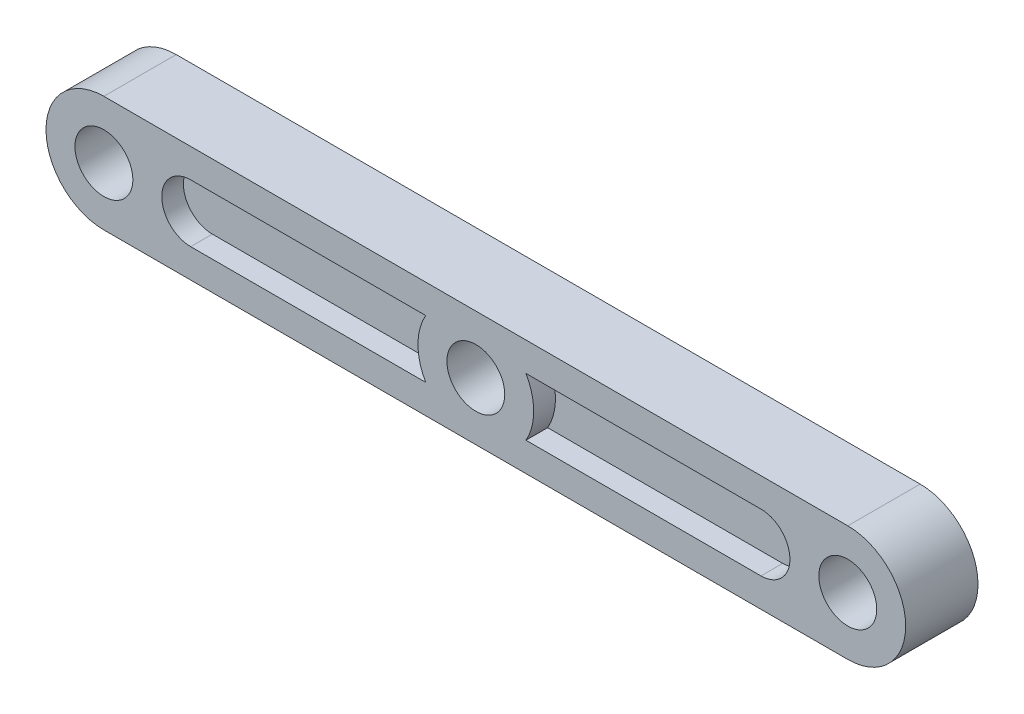
ISO-10303-21;
HEADER;
FILE_DESCRIPTION(('STEP AP214'),'2;1');
FILE_NAME('part.step','',(''),(''),'','','');
FILE_SCHEMA(('AUTOMOTIVE_DESIGN { 1 0 10303 214 1 1 1 1 }'));
ENDSEC;
DATA;
#1=APPLICATION_CONTEXT('core data for automotive mechanical design processes');
#2=APPLICATION_PROTOCOL_DEFINITION('international standard','automotive_design',2000,#1);
#3=PRODUCT_CONTEXT('',#1,'mechanical');
#4=PRODUCT('Part','Part','',(#3));
#5=PRODUCT_RELATED_PRODUCT_CATEGORY('part','',(#4));
#6=PRODUCT_DEFINITION_FORMATION('','',#4);
#7=PRODUCT_DEFINITION_CONTEXT('part definition',#1,'design');
#8=PRODUCT_DEFINITION('design','',#6,#7);
#9=PRODUCT_DEFINITION_SHAPE('','',#8);
#10=(LENGTH_UNIT() NAMED_UNIT(*) SI_UNIT(.MILLI.,.METRE.));
#11=(NAMED_UNIT(*) PLANE_ANGLE_UNIT() SI_UNIT($,.RADIAN.));
#12=(NAMED_UNIT(*) SI_UNIT($,.STERADIAN.) SOLID_ANGLE_UNIT());
#13=UNCERTAINTY_MEASURE_WITH_UNIT(LENGTH_MEASURE(1.E-05),#10,'distance_accuracy_value','');
#14=(GEOMETRIC_REPRESENTATION_CONTEXT(3) GLOBAL_UNCERTAINTY_ASSIGNED_CONTEXT((#13)) GLOBAL_UNIT_ASSIGNED_CONTEXT((#10,
#11,#12)) REPRESENTATION_CONTEXT('',''));
#15=CARTESIAN_POINT('',(0.,0.,0.));
#16=DIRECTION('',(0.,0.,1.));
#17=DIRECTION('',(1.,0.,0.));
#18=AXIS2_PLACEMENT_3D('',#15,#16,#17);
#19=CARTESIAN_POINT('',(45.4197,-2.5,1.5));
#20=DIRECTION('',(0.,-1.,0.));
#21=DIRECTION('',(1.,0.,0.));
#22=AXIS2_PLACEMENT_3D('',#19,#20,#21);
#23=PLANE('',#22);
#24=DIRECTION('',(-1.,0.,0.));
#25=VECTOR('',#24,1.);
#26=CARTESIAN_POINT('',(45.4197,-2.5,0.));
#27=LINE('',#26,#25);
#28=CARTESIAN_POINT('',(45.4197,-2.5,0.));
#29=VERTEX_POINT('',#28);
#30=CARTESIAN_POINT('',(28.8323489991992,-2.5,0.));
#31=VERTEX_POINT('',#30);
#32=EDGE_CURVE('E56',#29,#31,#27,.T.);
#33=ORIENTED_EDGE('',*,*,#32,.T.);
#34=DIRECTION('',(0.,0.,1.));
#35=VECTOR('',#34,1.);
#36=CARTESIAN_POINT('',(28.8323489991992,-2.5,0.));
#37=LINE('',#36,#35);
#38=CARTESIAN_POINT('',(28.8323489991992,-2.5,1.5));
#39=VERTEX_POINT('',#38);
#40=EDGE_CURVE('E309',#31,#39,#37,.T.);
#41=ORIENTED_EDGE('',*,*,#40,.T.);
#42=DIRECTION('',(-1.,0.,0.));
#43=VECTOR('',#42,1.);
#44=CARTESIAN_POINT('',(45.4197,-2.5,1.5));
#45=LINE('',#44,#43);
#46=CARTESIAN_POINT('',(45.4197,-2.5,1.5));
#47=VERTEX_POINT('',#46);
#48=EDGE_CURVE('E240',#47,#39,#45,.T.);
#49=ORIENTED_EDGE('',*,*,#48,.F.);
#50=DIRECTION('',(0.,0.,-1.));
#51=VECTOR('',#50,1.);
#52=CARTESIAN_POINT('',(45.4197,-2.5,1.5));
#53=LINE('',#52,#51);
#54=EDGE_CURVE('E243',#47,#29,#53,.T.);
#55=ORIENTED_EDGE('',*,*,#54,.T.);
#56=EDGE_LOOP('',(#33,#41,#49,#55));
#57=FACE_BOUND('',#56,.T.);
#58=ADVANCED_FACE('F33',(#57),#23,.F.);
#59=CARTESIAN_POINT('',(6.,2.5,1.5));
#60=DIRECTION('',(0.,1.,0.));
#61=DIRECTION('',(-1.,0.,0.));
#62=AXIS2_PLACEMENT_3D('',#59,#60,#61);
#63=PLANE('',#62);
#64=DIRECTION('',(1.,0.,0.));
#65=VECTOR('',#64,1.);
#66=CARTESIAN_POINT('',(6.,2.5,0.));
#67=LINE('',#66,#65);
#68=CARTESIAN_POINT('',(6.,2.5,0.));
#69=VERTEX_POINT('',#68);
#70=CARTESIAN_POINT('',(22.5873510008008,2.5,0.));
#71=VERTEX_POINT('',#70);
#72=EDGE_CURVE('E253',#69,#71,#67,.T.);
#73=ORIENTED_EDGE('',*,*,#72,.T.);
#74=DIRECTION('',(0.,0.,1.));
#75=VECTOR('',#74,1.);
#76=CARTESIAN_POINT('',(22.5873510008008,2.5,0.));
#77=LINE('',#76,#75);
#78=CARTESIAN_POINT('',(22.5873510008008,2.5,1.5));
#79=VERTEX_POINT('',#78);
#80=EDGE_CURVE('E315',#71,#79,#77,.T.);
#81=ORIENTED_EDGE('',*,*,#80,.T.);
#82=DIRECTION('',(1.,0.,0.));
#83=VECTOR('',#82,1.);
#84=CARTESIAN_POINT('',(6.,2.5,1.5));
#85=LINE('',#84,#83);
#86=CARTESIAN_POINT('',(6.,2.5,1.5));
#87=VERTEX_POINT('',#86);
#88=EDGE_CURVE('E265',#87,#79,#85,.T.);
#89=ORIENTED_EDGE('',*,*,#88,.F.);
#90=DIRECTION('',(0.,0.,-1.));
#91=VECTOR('',#90,1.);
#92=CARTESIAN_POINT('',(6.,2.5,1.5));
#93=LINE('',#92,#91);
#94=EDGE_CURVE('E236',#87,#69,#93,.T.);
#95=ORIENTED_EDGE('',*,*,#94,.T.);
#96=EDGE_LOOP('',(#73,#81,#89,#95));
#97=FACE_BOUND('',#96,.T.);
#98=ADVANCED_FACE('F386',(#97),#63,.F.);
#99=CARTESIAN_POINT('',(6.,0.,1.5));
#100=DIRECTION('',(0.,0.,-1.));
#101=DIRECTION('',(-1.,0.,0.));
#102=AXIS2_PLACEMENT_3D('',#99,#100,#101);
#103=PLANE('',#102);
#104=CARTESIAN_POINT('',(25.70985,0.,1.5));
#105=DIRECTION('',(0.,0.,-1.));
#106=DIRECTION('',(-1.,0.,0.));
#107=AXIS2_PLACEMENT_3D('',#104,#105,#106);
#108=CIRCLE('',#107,4.);
#109=CARTESIAN_POINT('',(28.8323489991992,2.5,1.5));
#110=VERTEX_POINT('',#109);
#111=EDGE_CURVE('E313',#110,#39,#108,.T.);
#112=ORIENTED_EDGE('',*,*,#111,.F.);
#113=CARTESIAN_POINT('',(45.4197,2.5,1.5));
#114=VERTEX_POINT('',#113);
#115=EDGE_CURVE('E267',#110,#114,#85,.T.);
#116=ORIENTED_EDGE('',*,*,#115,.T.);
#117=CARTESIAN_POINT('',(45.4197,0.,1.5));
#118=DIRECTION('',(0.,0.,-1.));
#119=DIRECTION('',(-1.,0.,0.));
#120=AXIS2_PLACEMENT_3D('',#117,#118,#119);
#121=CIRCLE('',#120,2.5);
#122=EDGE_CURVE('E262',#114,#47,#121,.T.);
#123=ORIENTED_EDGE('',*,*,#122,.T.);
#124=ORIENTED_EDGE('',*,*,#48,.T.);
#125=EDGE_LOOP('',(#112,#116,#123,#124));
#126=FACE_BOUND('',#125,.T.);
#127=ADVANCED_FACE('F392',(#126),#103,.T.);
#128=CARTESIAN_POINT('',(45.4197,2.,3.5));
#129=DIRECTION('',(0.,1.,0.));
#130=DIRECTION('',(-1.,0.,0.));
#131=AXIS2_PLACEMENT_3D('',#128,#129,#130);
#132=PLANE('',#131);
#133=DIRECTION('',(-1.,0.,0.));
#134=VECTOR('',#133,1.);
#135=CARTESIAN_POINT('',(45.4197,2.,3.5));
#136=LINE('',#135,#134);
#137=CARTESIAN_POINT('',(22.2457483848622,2.,3.5));
#138=VERTEX_POINT('',#137);
#139=CARTESIAN_POINT('',(6.,2.,3.5));
#140=VERTEX_POINT('',#139);
#141=EDGE_CURVE('E180',#138,#140,#136,.T.);
#142=ORIENTED_EDGE('',*,*,#141,.F.);
#143=DIRECTION('',(0.,0.,1.));
#144=VECTOR('',#143,1.);
#145=CARTESIAN_POINT('',(22.2457483848622,2.,0.));
#146=LINE('',#145,#144);
#147=CARTESIAN_POINT('',(22.2457483848622,2.,5.));
#148=VERTEX_POINT('',#147);
#149=EDGE_CURVE('E321',#138,#148,#146,.T.);
#150=ORIENTED_EDGE('',*,*,#149,.T.);
#151=DIRECTION('',(-1.,0.,0.));
#152=VECTOR('',#151,1.);
#153=CARTESIAN_POINT('',(45.4197,2.,5.));
#154=LINE('',#153,#152);
#155=CARTESIAN_POINT('',(6.,2.,5.));
#156=VERTEX_POINT('',#155);
#157=EDGE_CURVE('E281',#148,#156,#154,.T.);
#158=ORIENTED_EDGE('',*,*,#157,.T.);
#159=DIRECTION('',(0.,0.,1.));
#160=VECTOR('',#159,1.);
#161=CARTESIAN_POINT('',(6.,2.,3.5));
#162=LINE('',#161,#160);
#163=EDGE_CURVE('E258',#140,#156,#162,.T.);
#164=ORIENTED_EDGE('',*,*,#163,.F.);
#165=EDGE_LOOP('',(#142,#150,#158,#164));
#166=FACE_BOUND('',#165,.T.);
#167=ADVANCED_FACE('F429',(#166),#132,.F.);
#168=CARTESIAN_POINT('',(6.,-2.,3.5));
#169=DIRECTION('',(0.,-1.,0.));
#170=DIRECTION('',(0.,0.,-1.));
#171=AXIS2_PLACEMENT_3D('',#168,#169,#170);
#172=PLANE('',#171);
#173=DIRECTION('',(1.,0.,0.));
#174=VECTOR('',#173,1.);
#175=CARTESIAN_POINT('',(6.,-2.,3.5));
#176=LINE('',#175,#174);
#177=CARTESIAN_POINT('',(29.1739516151378,-2.,3.5));
#178=VERTEX_POINT('',#177);
#179=CARTESIAN_POINT('',(45.4197,-2.,3.5));
#180=VERTEX_POINT('',#179);
#181=EDGE_CURVE('E295',#178,#180,#176,.T.);
#182=ORIENTED_EDGE('',*,*,#181,.F.);
#183=DIRECTION('',(0.,0.,1.));
#184=VECTOR('',#183,1.);
#185=CARTESIAN_POINT('',(29.1739516151378,-2.,0.));
#186=LINE('',#185,#184);
#187=CARTESIAN_POINT('',(29.1739516151377,-2.,5.));
#188=VERTEX_POINT('',#187);
#189=EDGE_CURVE('E191',#178,#188,#186,.T.);
#190=ORIENTED_EDGE('',*,*,#189,.T.);
#191=DIRECTION('',(1.,0.,0.));
#192=VECTOR('',#191,1.);
#193=CARTESIAN_POINT('',(6.,-2.,5.));
#194=LINE('',#193,#192);
#195=CARTESIAN_POINT('',(45.4197,-2.,5.));
#196=VERTEX_POINT('',#195);
#197=EDGE_CURVE('E287',#188,#196,#194,.T.);
#198=ORIENTED_EDGE('',*,*,#197,.T.);
#199=DIRECTION('',(0.,0.,1.));
#200=VECTOR('',#199,1.);
#201=CARTESIAN_POINT('',(45.4197,-2.,3.5));
#202=LINE('',#201,#200);
#203=EDGE_CURVE('E272',#180,#196,#202,.T.);
#204=ORIENTED_EDGE('',*,*,#203,.F.);
#205=EDGE_LOOP('',(#182,#190,#198,#204));
#206=FACE_BOUND('',#205,.T.);
#207=ADVANCED_FACE('F434',(#206),#172,.F.);
#208=CARTESIAN_POINT('',(6.,0.,3.5));
#209=DIRECTION('',(0.,0.,1.));
#210=DIRECTION('',(1.,0.,0.));
#211=AXIS2_PLACEMENT_3D('',#208,#209,#210);
#212=PLANE('',#211);
#213=CARTESIAN_POINT('',(25.70985,0.,3.5));
#214=DIRECTION('',(0.,0.,1.));
#215=DIRECTION('',(1.,0.,0.));
#216=AXIS2_PLACEMENT_3D('',#213,#214,#215);
#217=CIRCLE('',#216,4.);
#218=CARTESIAN_POINT('',(22.2457483848622,-2.,3.5));
#219=VERTEX_POINT('',#218);
#220=EDGE_CURVE('E11',#138,#219,#217,.T.);
#221=ORIENTED_EDGE('',*,*,#220,.F.);
#222=ORIENTED_EDGE('',*,*,#141,.T.);
#223=CARTESIAN_POINT('',(6.,0.,3.5));
#224=DIRECTION('',(0.,0.,1.));
#225=DIRECTION('',(1.,0.,0.));
#226=AXIS2_PLACEMENT_3D('',#223,#224,#225);
#227=CIRCLE('',#226,2.);
#228=CARTESIAN_POINT('',(6.,-2.,3.5));
#229=VERTEX_POINT('',#228);
#230=EDGE_CURVE('E280',#140,#229,#227,.T.);
#231=ORIENTED_EDGE('',*,*,#230,.T.);
#232=EDGE_CURVE('E292',#229,#219,#176,.T.);
#233=ORIENTED_EDGE('',*,*,#232,.T.);
#234=EDGE_LOOP('',(#221,#222,#231,#233));
#235=FACE_BOUND('',#234,.T.);
#236=ADVANCED_FACE('F468',(#235),#212,.T.);
#237=CARTESIAN_POINT('',(0.,0.,5.));
#238=DIRECTION('',(0.,0.,-1.));
#239=DIRECTION('',(-1.,0.,0.));
#240=AXIS2_PLACEMENT_3D('',#237,#238,#239);
#241=CYLINDRICAL_SURFACE('',#240,4.);
#242=CARTESIAN_POINT('',(0.,0.,0.));
#243=DIRECTION('',(0.,0.,-1.));
#244=DIRECTION('',(-1.,0.,0.));
#245=AXIS2_PLACEMENT_3D('',#242,#243,#244);
#246=CIRCLE('',#245,4.);
#247=CARTESIAN_POINT('',(0.,-4.,0.));
#248=VERTEX_POINT('',#247);
#249=CARTESIAN_POINT('',(0.,4.,0.));
#250=VERTEX_POINT('',#249);
#251=EDGE_CURVE('E223',#248,#250,#246,.T.);
#252=ORIENTED_EDGE('',*,*,#251,.F.);
#253=DIRECTION('',(0.,0.,-1.));
#254=VECTOR('',#253,1.);
#255=CARTESIAN_POINT('',(0.,-4.,5.));
#256=LINE('',#255,#254);
#257=CARTESIAN_POINT('',(0.,-4.,5.));
#258=VERTEX_POINT('',#257);
#259=EDGE_CURVE('E195',#258,#248,#256,.T.);
#260=ORIENTED_EDGE('',*,*,#259,.F.);
#261=CARTESIAN_POINT('',(0.,0.,5.));
#262=DIRECTION('',(0.,0.,-1.));
#263=DIRECTION('',(-1.,0.,0.));
#264=AXIS2_PLACEMENT_3D('',#261,#262,#263);
#265=CIRCLE('',#264,4.);
#266=CARTESIAN_POINT('',(0.,4.,5.));
#267=VERTEX_POINT('',#266);
#268=EDGE_CURVE('E232',#258,#267,#265,.T.);
#269=ORIENTED_EDGE('',*,*,#268,.T.);
#270=DIRECTION('',(0.,0.,-1.));
#271=VECTOR('',#270,1.);
#272=CARTESIAN_POINT('',(0.,4.,5.));
#273=LINE('',#272,#271);
#274=EDGE_CURVE('E210',#267,#250,#273,.T.);
#275=ORIENTED_EDGE('',*,*,#274,.T.);
#276=EDGE_LOOP('',(#252,#260,#269,#275));
#277=FACE_BOUND('',#276,.T.);
#278=ADVANCED_FACE('F35',(#277),#241,.T.);
#279=CARTESIAN_POINT('',(51.4197,-4.,5.));
#280=DIRECTION('',(0.,-1.,0.));
#281=DIRECTION('',(1.,0.,0.));
#282=AXIS2_PLACEMENT_3D('',#279,#280,#281);
#283=PLANE('',#282);
#284=DIRECTION('',(-1.,0.,0.));
#285=VECTOR('',#284,1.);
#286=CARTESIAN_POINT('',(51.4197,-4.,5.));
#287=LINE('',#286,#285);
#288=CARTESIAN_POINT('',(51.4197,-4.,5.));
#289=VERTEX_POINT('',#288);
#290=EDGE_CURVE('E211',#289,#258,#287,.T.);
#291=ORIENTED_EDGE('',*,*,#290,.T.);
#292=ORIENTED_EDGE('',*,*,#259,.T.);
#293=DIRECTION('',(-1.,0.,0.));
#294=VECTOR('',#293,1.);
#295=CARTESIAN_POINT('',(51.4197,-4.,0.));
#296=LINE('',#295,#294);
#297=CARTESIAN_POINT('',(51.4197,-4.,0.));
#298=VERTEX_POINT('',#297);
#299=EDGE_CURVE('E206',#298,#248,#296,.T.);
#300=ORIENTED_EDGE('',*,*,#299,.F.);
#301=DIRECTION('',(0.,0.,-1.));
#302=VECTOR('',#301,1.);
#303=CARTESIAN_POINT('',(51.4197,-4.,5.));
#304=LINE('',#303,#302);
#305=EDGE_CURVE('E197',#289,#298,#304,.T.);
#306=ORIENTED_EDGE('',*,*,#305,.F.);
#307=EDGE_LOOP('',(#291,#292,#300,#306));
#308=FACE_BOUND('',#307,.T.);
#309=ADVANCED_FACE('F490',(#308),#283,.T.);
#310=CARTESIAN_POINT('',(51.4197,0.,5.));
#311=DIRECTION('',(0.,0.,-1.));
#312=DIRECTION('',(-1.,0.,0.));
#313=AXIS2_PLACEMENT_3D('',#310,#311,#312);
#314=CYLINDRICAL_SURFACE('',#313,4.);
#315=CARTESIAN_POINT('',(51.4197,0.,0.));
#316=DIRECTION('',(0.,0.,-1.));
#317=DIRECTION('',(-1.,0.,0.));
#318=AXIS2_PLACEMENT_3D('',#315,#316,#317);
#319=CIRCLE('',#318,4.);
#320=CARTESIAN_POINT('',(51.4197,4.,0.));
#321=VERTEX_POINT('',#320);
#322=EDGE_CURVE('E228',#321,#298,#319,.T.);
#323=ORIENTED_EDGE('',*,*,#322,.F.);
#324=DIRECTION('',(0.,0.,-1.));
#325=VECTOR('',#324,1.);
#326=CARTESIAN_POINT('',(51.4197,4.,5.));
#327=LINE('',#326,#325);
#328=CARTESIAN_POINT('',(51.4197,4.,5.));
#329=VERTEX_POINT('',#328);
#330=EDGE_CURVE('E203',#329,#321,#327,.T.);
#331=ORIENTED_EDGE('',*,*,#330,.F.);
#332=CARTESIAN_POINT('',(51.4197,0.,5.));
#333=DIRECTION('',(0.,0.,-1.));
#334=DIRECTION('',(-1.,0.,0.));
#335=AXIS2_PLACEMENT_3D('',#332,#333,#334);
#336=CIRCLE('',#335,4.);
#337=EDGE_CURVE('E215',#329,#289,#336,.T.);
#338=ORIENTED_EDGE('',*,*,#337,.T.);
#339=ORIENTED_EDGE('',*,*,#305,.T.);
#340=EDGE_LOOP('',(#323,#331,#338,#339));
#341=FACE_BOUND('',#340,.T.);
#342=ADVANCED_FACE('F501',(#341),#314,.T.);
#343=CARTESIAN_POINT('',(0.,4.,5.));
#344=DIRECTION('',(0.,1.,0.));
#345=DIRECTION('',(-1.,0.,0.));
#346=AXIS2_PLACEMENT_3D('',#343,#344,#345);
#347=PLANE('',#346);
#348=DIRECTION('',(1.,0.,0.));
#349=VECTOR('',#348,1.);
#350=CARTESIAN_POINT('',(0.,4.,5.));
#351=LINE('',#350,#349);
#352=EDGE_CURVE('E219',#267,#329,#351,.T.);
#353=ORIENTED_EDGE('',*,*,#352,.T.);
#354=ORIENTED_EDGE('',*,*,#330,.T.);
#355=DIRECTION('',(1.,0.,0.));
#356=VECTOR('',#355,1.);
#357=CARTESIAN_POINT('',(0.,4.,0.));
#358=LINE('',#357,#356);
#359=EDGE_CURVE('E226',#250,#321,#358,.T.);
#360=ORIENTED_EDGE('',*,*,#359,.F.);
#361=ORIENTED_EDGE('',*,*,#274,.F.);
#362=EDGE_LOOP('',(#353,#354,#360,#361));
#363=FACE_BOUND('',#362,.T.);
#364=ADVANCED_FACE('F351',(#363),#347,.T.);
#365=CARTESIAN_POINT('',(0.,0.,5.));
#366=DIRECTION('',(0.,0.,-1.));
#367=DIRECTION('',(-1.,0.,0.));
#368=AXIS2_PLACEMENT_3D('',#365,#366,#367);
#369=PLANE('',#368);
#370=CARTESIAN_POINT('',(25.70985,0.,5.));
#371=DIRECTION('',(0.,0.,1.));
#372=DIRECTION('',(1.,0.,0.));
#373=AXIS2_PLACEMENT_3D('',#370,#371,#372);
#374=CIRCLE('',#373,1.99999999999999);
#375=CARTESIAN_POINT('',(27.70985,0.,5.));
#376=VERTEX_POINT('',#375);
#377=EDGE_CURVE('E333',#376,#376,#374,.T.);
#378=ORIENTED_EDGE('',*,*,#377,.F.);
#379=EDGE_LOOP('',(#378));
#380=FACE_BOUND('',#379,.T.);
#381=ORIENTED_EDGE('',*,*,#337,.F.);
#382=ORIENTED_EDGE('',*,*,#352,.F.);
#383=ORIENTED_EDGE('',*,*,#268,.F.);
#384=ORIENTED_EDGE('',*,*,#290,.F.);
#385=EDGE_LOOP('',(#381,#382,#383,#384));
#386=FACE_BOUND('',#385,.T.);
#387=CARTESIAN_POINT('',(25.70985,0.,5.));
#388=DIRECTION('',(0.,0.,1.));
#389=DIRECTION('',(1.,0.,0.));
#390=AXIS2_PLACEMENT_3D('',#387,#388,#389);
#391=CIRCLE('',#390,4.);
#392=CARTESIAN_POINT('',(29.1739516151378,2.,5.));
#393=VERTEX_POINT('',#392);
#394=EDGE_CURVE('E326',#188,#393,#391,.T.);
#395=ORIENTED_EDGE('',*,*,#394,.T.);
#396=CARTESIAN_POINT('',(45.4197,2.,5.));
#397=VERTEX_POINT('',#396);
#398=EDGE_CURVE('E186',#397,#393,#154,.T.);
#399=ORIENTED_EDGE('',*,*,#398,.F.);
#400=CARTESIAN_POINT('',(45.4197,0.,5.));
#401=DIRECTION('',(0.,0.,1.));
#402=DIRECTION('',(1.,0.,0.));
#403=AXIS2_PLACEMENT_3D('',#400,#401,#402);
#404=CIRCLE('',#403,2.);
#405=EDGE_CURVE('E282',#196,#397,#404,.T.);
#406=ORIENTED_EDGE('',*,*,#405,.F.);
#407=ORIENTED_EDGE('',*,*,#197,.F.);
#408=EDGE_LOOP('',(#395,#399,#406,#407));
#409=FACE_BOUND('',#408,.T.);
#410=CARTESIAN_POINT('',(51.4197,0.,5.));
#411=DIRECTION('',(0.,0.,-1.));
#412=DIRECTION('',(-1.,0.,0.));
#413=AXIS2_PLACEMENT_3D('',#410,#411,#412);
#414=CIRCLE('',#413,1.99999999999999);
#415=CARTESIAN_POINT('',(49.4197,0.,5.));
#416=VERTEX_POINT('',#415);
#417=EDGE_CURVE('E303',#416,#416,#414,.T.);
#418=ORIENTED_EDGE('',*,*,#417,.T.);
#419=EDGE_LOOP('',(#418));
#420=FACE_BOUND('',#419,.T.);
#421=ORIENTED_EDGE('',*,*,#157,.F.);
#422=CARTESIAN_POINT('',(22.2457483848622,-2.,5.));
#423=VERTEX_POINT('',#422);
#424=EDGE_CURVE('E328',#148,#423,#391,.T.);
#425=ORIENTED_EDGE('',*,*,#424,.T.);
#426=CARTESIAN_POINT('',(6.,-2.,5.));
#427=VERTEX_POINT('',#426);
#428=EDGE_CURVE('E285',#427,#423,#194,.T.);
#429=ORIENTED_EDGE('',*,*,#428,.F.);
#430=CARTESIAN_POINT('',(6.,0.,5.));
#431=DIRECTION('',(0.,0.,1.));
#432=DIRECTION('',(1.,0.,0.));
#433=AXIS2_PLACEMENT_3D('',#430,#431,#432);
#434=CIRCLE('',#433,2.);
#435=EDGE_CURVE('E288',#156,#427,#434,.T.);
#436=ORIENTED_EDGE('',*,*,#435,.F.);
#437=EDGE_LOOP('',(#421,#425,#429,#436));
#438=FACE_BOUND('',#437,.T.);
#439=CARTESIAN_POINT('',(0.,0.,5.));
#440=DIRECTION('',(0.,0.,-1.));
#441=DIRECTION('',(-1.,0.,0.));
#442=AXIS2_PLACEMENT_3D('',#439,#440,#441);
#443=CIRCLE('',#442,1.99999999999999);
#444=CARTESIAN_POINT('',(-1.99999999999999,0.,5.));
#445=VERTEX_POINT('',#444);
#446=EDGE_CURVE('E289',#445,#445,#443,.T.);
#447=ORIENTED_EDGE('',*,*,#446,.T.);
#448=EDGE_LOOP('',(#447));
#449=FACE_BOUND('',#448,.T.);
#450=ADVANCED_FACE('F348',(#380,#386,#409,#420,#438,#449),#369,.F.);
#451=CARTESIAN_POINT('',(0.,0.,0.));
#452=DIRECTION('',(0.,0.,-1.));
#453=DIRECTION('',(-1.,0.,0.));
#454=AXIS2_PLACEMENT_3D('',#451,#452,#453);
#455=PLANE('',#454);
#456=CARTESIAN_POINT('',(25.70985,0.,0.));
#457=DIRECTION('',(0.,0.,1.));
#458=DIRECTION('',(1.,0.,0.));
#459=AXIS2_PLACEMENT_3D('',#456,#457,#458);
#460=CIRCLE('',#459,1.99999999999999);
#461=CARTESIAN_POINT('',(27.70985,0.,0.));
#462=VERTEX_POINT('',#461);
#463=EDGE_CURVE('E329',#462,#462,#460,.T.);
#464=ORIENTED_EDGE('',*,*,#463,.T.);
#465=EDGE_LOOP('',(#464));
#466=FACE_BOUND('',#465,.T.);
#467=ORIENTED_EDGE('',*,*,#359,.T.);
#468=ORIENTED_EDGE('',*,*,#322,.T.);
#469=ORIENTED_EDGE('',*,*,#299,.T.);
#470=ORIENTED_EDGE('',*,*,#251,.T.);
#471=EDGE_LOOP('',(#467,#468,#469,#470));
#472=FACE_BOUND('',#471,.T.);
#473=CARTESIAN_POINT('',(28.8323489991992,2.5,0.));
#474=VERTEX_POINT('',#473);
#475=CARTESIAN_POINT('',(45.4197,2.5,0.));
#476=VERTEX_POINT('',#475);
#477=EDGE_CURVE('E255',#474,#476,#67,.T.);
#478=ORIENTED_EDGE('',*,*,#477,.F.);
#479=CARTESIAN_POINT('',(25.70985,0.,0.));
#480=DIRECTION('',(0.,0.,1.));
#481=DIRECTION('',(1.,0.,0.));
#482=AXIS2_PLACEMENT_3D('',#479,#480,#481);
#483=CIRCLE('',#482,4.);
#484=EDGE_CURVE('E330',#31,#474,#483,.T.);
#485=ORIENTED_EDGE('',*,*,#484,.F.);
#486=ORIENTED_EDGE('',*,*,#32,.F.);
#487=CARTESIAN_POINT('',(45.4197,0.,0.));
#488=DIRECTION('',(0.,0.,-1.));
#489=DIRECTION('',(-1.,0.,0.));
#490=AXIS2_PLACEMENT_3D('',#487,#488,#489);
#491=CIRCLE('',#490,2.5);
#492=EDGE_CURVE('E250',#476,#29,#491,.T.);
#493=ORIENTED_EDGE('',*,*,#492,.F.);
#494=EDGE_LOOP('',(#478,#485,#486,#493));
#495=FACE_BOUND('',#494,.T.);
#496=CARTESIAN_POINT('',(22.5873510008008,-2.5,0.));
#497=VERTEX_POINT('',#496);
#498=EDGE_CURVE('E325',#71,#497,#483,.T.);
#499=ORIENTED_EDGE('',*,*,#498,.F.);
#500=ORIENTED_EDGE('',*,*,#72,.F.);
#501=CARTESIAN_POINT('',(6.,0.,0.));
#502=DIRECTION('',(0.,0.,-1.));
#503=DIRECTION('',(-1.,0.,0.));
#504=AXIS2_PLACEMENT_3D('',#501,#502,#503);
#505=CIRCLE('',#504,2.5);
#506=CARTESIAN_POINT('',(6.,-2.5,0.));
#507=VERTEX_POINT('',#506);
#508=EDGE_CURVE('E256',#507,#69,#505,.T.);
#509=ORIENTED_EDGE('',*,*,#508,.F.);
#510=EDGE_CURVE('E249',#497,#507,#27,.T.);
#511=ORIENTED_EDGE('',*,*,#510,.F.);
#512=EDGE_LOOP('',(#499,#500,#509,#511));
#513=FACE_BOUND('',#512,.T.);
#514=CARTESIAN_POINT('',(51.4197,0.,0.));
#515=DIRECTION('',(0.,0.,-1.));
#516=DIRECTION('',(-1.,0.,0.));
#517=AXIS2_PLACEMENT_3D('',#514,#515,#516);
#518=CIRCLE('',#517,1.99999999999999);
#519=CARTESIAN_POINT('',(49.4197,0.,0.));
#520=VERTEX_POINT('',#519);
#521=EDGE_CURVE('E306',#520,#520,#518,.T.);
#522=ORIENTED_EDGE('',*,*,#521,.F.);
#523=EDGE_LOOP('',(#522));
#524=FACE_BOUND('',#523,.T.);
#525=CARTESIAN_POINT('',(0.,0.,0.));
#526=DIRECTION('',(0.,0.,-1.));
#527=DIRECTION('',(-1.,0.,0.));
#528=AXIS2_PLACEMENT_3D('',#525,#526,#527);
#529=CIRCLE('',#528,1.99999999999999);
#530=CARTESIAN_POINT('',(-1.99999999999999,0.,0.));
#531=VERTEX_POINT('',#530);
#532=EDGE_CURVE('E300',#531,#531,#529,.T.);
#533=ORIENTED_EDGE('',*,*,#532,.F.);
#534=EDGE_LOOP('',(#533));
#535=FACE_BOUND('',#534,.T.);
#536=ADVANCED_FACE('F339',(#466,#472,#495,#513,#524,#535),#455,.T.);
#537=CARTESIAN_POINT('',(6.,0.,1.5));
#538=DIRECTION('',(0.,0.,-1.));
#539=DIRECTION('',(-1.,0.,0.));
#540=AXIS2_PLACEMENT_3D('',#537,#538,#539);
#541=CYLINDRICAL_SURFACE('',#540,2.5);
#542=ORIENTED_EDGE('',*,*,#508,.T.);
#543=ORIENTED_EDGE('',*,*,#94,.F.);
#544=CARTESIAN_POINT('',(6.,0.,1.5));
#545=DIRECTION('',(0.,0.,-1.));
#546=DIRECTION('',(-1.,0.,0.));
#547=AXIS2_PLACEMENT_3D('',#544,#545,#546);
#548=CIRCLE('',#547,2.5);
#549=CARTESIAN_POINT('',(6.,-2.5,1.5));
#550=VERTEX_POINT('',#549);
#551=EDGE_CURVE('E248',#550,#87,#548,.T.);
#552=ORIENTED_EDGE('',*,*,#551,.F.);
#553=DIRECTION('',(0.,0.,-1.));
#554=VECTOR('',#553,1.);
#555=CARTESIAN_POINT('',(6.,-2.5,1.5));
#556=LINE('',#555,#554);
#557=EDGE_CURVE('E227',#550,#507,#556,.T.);
#558=ORIENTED_EDGE('',*,*,#557,.T.);
#559=EDGE_LOOP('',(#542,#543,#552,#558));
#560=FACE_BOUND('',#559,.T.);
#561=ADVANCED_FACE('F375',(#560),#541,.F.);
#562=CARTESIAN_POINT('',(22.5873510008008,-2.5,1.5));
#563=VERTEX_POINT('',#562);
#564=EDGE_CURVE('E261',#563,#550,#45,.T.);
#565=ORIENTED_EDGE('',*,*,#564,.F.);
#566=DIRECTION('',(0.,0.,1.));
#567=VECTOR('',#566,1.);
#568=CARTESIAN_POINT('',(22.5873510008008,-2.5,0.));
#569=LINE('',#568,#567);
#570=EDGE_CURVE('E48',#563,#497,#569,.F.);
#571=ORIENTED_EDGE('',*,*,#570,.T.);
#572=ORIENTED_EDGE('',*,*,#510,.T.);
#573=ORIENTED_EDGE('',*,*,#557,.F.);
#574=EDGE_LOOP('',(#565,#571,#572,#573));
#575=FACE_BOUND('',#574,.T.);
#576=ADVANCED_FACE('F381',(#575),#23,.F.);
#577=CARTESIAN_POINT('',(45.4197,0.,1.5));
#578=DIRECTION('',(0.,0.,-1.));
#579=DIRECTION('',(-1.,0.,0.));
#580=AXIS2_PLACEMENT_3D('',#577,#578,#579);
#581=CYLINDRICAL_SURFACE('',#580,2.5);
#582=ORIENTED_EDGE('',*,*,#492,.T.);
#583=ORIENTED_EDGE('',*,*,#54,.F.);
#584=ORIENTED_EDGE('',*,*,#122,.F.);
#585=DIRECTION('',(0.,0.,-1.));
#586=VECTOR('',#585,1.);
#587=CARTESIAN_POINT('',(45.4197,2.5,1.5));
#588=LINE('',#587,#586);
#589=EDGE_CURVE('E239',#114,#476,#588,.T.);
#590=ORIENTED_EDGE('',*,*,#589,.T.);
#591=EDGE_LOOP('',(#582,#583,#584,#590));
#592=FACE_BOUND('',#591,.T.);
#593=ADVANCED_FACE('F399',(#592),#581,.F.);
#594=ORIENTED_EDGE('',*,*,#115,.F.);
#595=DIRECTION('',(0.,0.,1.));
#596=VECTOR('',#595,1.);
#597=CARTESIAN_POINT('',(28.8323489991992,2.5,0.));
#598=LINE('',#597,#596);
#599=EDGE_CURVE('E311',#110,#474,#598,.F.);
#600=ORIENTED_EDGE('',*,*,#599,.T.);
#601=ORIENTED_EDGE('',*,*,#477,.T.);
#602=ORIENTED_EDGE('',*,*,#589,.F.);
#603=EDGE_LOOP('',(#594,#600,#601,#602));
#604=FACE_BOUND('',#603,.T.);
#605=ADVANCED_FACE('F395',(#604),#63,.F.);
#606=EDGE_CURVE('E318',#563,#79,#108,.T.);
#607=ORIENTED_EDGE('',*,*,#606,.F.);
#608=ORIENTED_EDGE('',*,*,#564,.T.);
#609=ORIENTED_EDGE('',*,*,#551,.T.);
#610=ORIENTED_EDGE('',*,*,#88,.T.);
#611=EDGE_LOOP('',(#607,#608,#609,#610));
#612=FACE_BOUND('',#611,.T.);
#613=ADVANCED_FACE('F418',(#612),#103,.T.);
#614=CARTESIAN_POINT('',(6.,0.,3.5));
#615=DIRECTION('',(0.,0.,1.));
#616=DIRECTION('',(1.,0.,0.));
#617=AXIS2_PLACEMENT_3D('',#614,#615,#616);
#618=CYLINDRICAL_SURFACE('',#617,2.);
#619=ORIENTED_EDGE('',*,*,#435,.T.);
#620=DIRECTION('',(0.,0.,1.));
#621=VECTOR('',#620,1.);
#622=CARTESIAN_POINT('',(6.,-2.,3.5));
#623=LINE('',#622,#621);
#624=EDGE_CURVE('E179',#229,#427,#623,.T.);
#625=ORIENTED_EDGE('',*,*,#624,.F.);
#626=ORIENTED_EDGE('',*,*,#230,.F.);
#627=ORIENTED_EDGE('',*,*,#163,.T.);
#628=EDGE_LOOP('',(#619,#625,#626,#627));
#629=FACE_BOUND('',#628,.T.);
#630=ADVANCED_FACE('F420',(#629),#618,.F.);
#631=ORIENTED_EDGE('',*,*,#398,.T.);
#632=DIRECTION('',(0.,0.,1.));
#633=VECTOR('',#632,1.);
#634=CARTESIAN_POINT('',(29.1739516151378,2.,0.));
#635=LINE('',#634,#633);
#636=CARTESIAN_POINT('',(29.1739516151378,2.,3.5));
#637=VERTEX_POINT('',#636);
#638=EDGE_CURVE('E183',#393,#637,#635,.F.);
#639=ORIENTED_EDGE('',*,*,#638,.T.);
#640=CARTESIAN_POINT('',(45.4197,2.,3.5));
#641=VERTEX_POINT('',#640);
#642=EDGE_CURVE('E171',#641,#637,#136,.T.);
#643=ORIENTED_EDGE('',*,*,#642,.F.);
#644=DIRECTION('',(0.,0.,1.));
#645=VECTOR('',#644,1.);
#646=CARTESIAN_POINT('',(45.4197,2.,3.5));
#647=LINE('',#646,#645);
#648=EDGE_CURVE('E275',#641,#397,#647,.T.);
#649=ORIENTED_EDGE('',*,*,#648,.T.);
#650=EDGE_LOOP('',(#631,#639,#643,#649));
#651=FACE_BOUND('',#650,.T.);
#652=ADVANCED_FACE('F184',(#651),#132,.F.);
#653=CARTESIAN_POINT('',(45.4197,0.,3.5));
#654=DIRECTION('',(0.,0.,1.));
#655=DIRECTION('',(1.,0.,0.));
#656=AXIS2_PLACEMENT_3D('',#653,#654,#655);
#657=CYLINDRICAL_SURFACE('',#656,2.);
#658=ORIENTED_EDGE('',*,*,#405,.T.);
#659=ORIENTED_EDGE('',*,*,#648,.F.);
#660=CARTESIAN_POINT('',(45.4197,0.,3.5));
#661=DIRECTION('',(0.,0.,1.));
#662=DIRECTION('',(1.,0.,0.));
#663=AXIS2_PLACEMENT_3D('',#660,#661,#662);
#664=CIRCLE('',#663,2.);
#665=EDGE_CURVE('E177',#180,#641,#664,.T.);
#666=ORIENTED_EDGE('',*,*,#665,.F.);
#667=ORIENTED_EDGE('',*,*,#203,.T.);
#668=EDGE_LOOP('',(#658,#659,#666,#667));
#669=FACE_BOUND('',#668,.T.);
#670=ADVANCED_FACE('F470',(#669),#657,.F.);
#671=ORIENTED_EDGE('',*,*,#428,.T.);
#672=DIRECTION('',(0.,0.,1.));
#673=VECTOR('',#672,1.);
#674=CARTESIAN_POINT('',(22.2457483848622,-2.,0.));
#675=LINE('',#674,#673);
#676=EDGE_CURVE('E190',#423,#219,#675,.F.);
#677=ORIENTED_EDGE('',*,*,#676,.T.);
#678=ORIENTED_EDGE('',*,*,#232,.F.);
#679=ORIENTED_EDGE('',*,*,#624,.T.);
#680=EDGE_LOOP('',(#671,#677,#678,#679));
#681=FACE_BOUND('',#680,.T.);
#682=ADVANCED_FACE('F467',(#681),#172,.F.);
#683=EDGE_CURVE('E37',#178,#637,#217,.T.);
#684=ORIENTED_EDGE('',*,*,#683,.F.);
#685=ORIENTED_EDGE('',*,*,#181,.T.);
#686=ORIENTED_EDGE('',*,*,#665,.T.);
#687=ORIENTED_EDGE('',*,*,#642,.T.);
#688=EDGE_LOOP('',(#684,#685,#686,#687));
#689=FACE_BOUND('',#688,.T.);
#690=ADVANCED_FACE('F173',(#689),#212,.T.);
#691=CARTESIAN_POINT('',(0.,0.,0.));
#692=DIRECTION('',(0.,0.,-1.));
#693=DIRECTION('',(-1.,0.,0.));
#694=AXIS2_PLACEMENT_3D('',#691,#692,#693);
#695=CYLINDRICAL_SURFACE('',#694,1.99999999999999);
#696=ORIENTED_EDGE('',*,*,#446,.F.);
#697=EDGE_LOOP('',(#696));
#698=FACE_BOUND('',#697,.T.);
#699=ORIENTED_EDGE('',*,*,#532,.T.);
#700=EDGE_LOOP('',(#699));
#701=FACE_BOUND('',#700,.T.);
#702=ADVANCED_FACE('F367',(#698,#701),#695,.F.);
#703=CARTESIAN_POINT('',(51.4197,0.,0.));
#704=DIRECTION('',(0.,0.,-1.));
#705=DIRECTION('',(-1.,0.,0.));
#706=AXIS2_PLACEMENT_3D('',#703,#704,#705);
#707=CYLINDRICAL_SURFACE('',#706,1.99999999999999);
#708=ORIENTED_EDGE('',*,*,#417,.F.);
#709=EDGE_LOOP('',(#708));
#710=FACE_BOUND('',#709,.T.);
#711=ORIENTED_EDGE('',*,*,#521,.T.);
#712=EDGE_LOOP('',(#711));
#713=FACE_BOUND('',#712,.T.);
#714=ADVANCED_FACE('F370',(#710,#713),#707,.F.);
#715=CARTESIAN_POINT('',(25.70985,0.,0.));
#716=DIRECTION('',(0.,0.,1.));
#717=DIRECTION('',(1.,0.,0.));
#718=AXIS2_PLACEMENT_3D('',#715,#716,#717);
#719=CYLINDRICAL_SURFACE('',#718,4.);
#720=ORIENTED_EDGE('',*,*,#638,.F.);
#721=ORIENTED_EDGE('',*,*,#394,.F.);
#722=ORIENTED_EDGE('',*,*,#189,.F.);
#723=ORIENTED_EDGE('',*,*,#683,.T.);
#724=EDGE_LOOP('',(#720,#721,#722,#723));
#725=FACE_BOUND('',#724,.T.);
#726=ADVANCED_FACE('F194',(#725),#719,.T.);
#727=ORIENTED_EDGE('',*,*,#149,.F.);
#728=ORIENTED_EDGE('',*,*,#220,.T.);
#729=ORIENTED_EDGE('',*,*,#676,.F.);
#730=ORIENTED_EDGE('',*,*,#424,.F.);
#731=EDGE_LOOP('',(#727,#728,#729,#730));
#732=FACE_BOUND('',#731,.T.);
#733=ADVANCED_FACE('F450',(#732),#719,.T.);
#734=ORIENTED_EDGE('',*,*,#40,.F.);
#735=ORIENTED_EDGE('',*,*,#484,.T.);
#736=ORIENTED_EDGE('',*,*,#599,.F.);
#737=ORIENTED_EDGE('',*,*,#111,.T.);
#738=EDGE_LOOP('',(#734,#735,#736,#737));
#739=FACE_BOUND('',#738,.T.);
#740=ADVANCED_FACE('F445',(#739),#719,.T.);
#741=ORIENTED_EDGE('',*,*,#570,.F.);
#742=ORIENTED_EDGE('',*,*,#606,.T.);
#743=ORIENTED_EDGE('',*,*,#80,.F.);
#744=ORIENTED_EDGE('',*,*,#498,.T.);
#745=EDGE_LOOP('',(#741,#742,#743,#744));
#746=FACE_BOUND('',#745,.T.);
#747=ADVANCED_FACE('F344',(#746),#719,.T.);
#748=CARTESIAN_POINT('',(25.70985,0.,0.));
#749=DIRECTION('',(0.,0.,1.));
#750=DIRECTION('',(1.,0.,0.));
#751=AXIS2_PLACEMENT_3D('',#748,#749,#750);
#752=CYLINDRICAL_SURFACE('',#751,1.99999999999999);
#753=ORIENTED_EDGE('',*,*,#463,.F.);
#754=EDGE_LOOP('',(#753));
#755=FACE_BOUND('',#754,.T.);
#756=ORIENTED_EDGE('',*,*,#377,.T.);
#757=EDGE_LOOP('',(#756));
#758=FACE_BOUND('',#757,.T.);
#759=ADVANCED_FACE('F341',(#755,#758),#752,.F.);
#760=CLOSED_SHELL('',(#58,#98,#127,#167,#207,#236,#278,#309,#342,#364,#450,#536,#561,#576,#593,
#605,#613,#630,#652,#670,#682,#690,#702,#714,#726,#733,#740,#747,#759));
#761=MANIFOLD_SOLID_BREP('B2',#760);
#762=ADVANCED_BREP_SHAPE_REPRESENTATION('',(#18,#761),#14);
#763=SHAPE_DEFINITION_REPRESENTATION(#9,#762);
ENDSEC;
END-ISO-10303-21;
